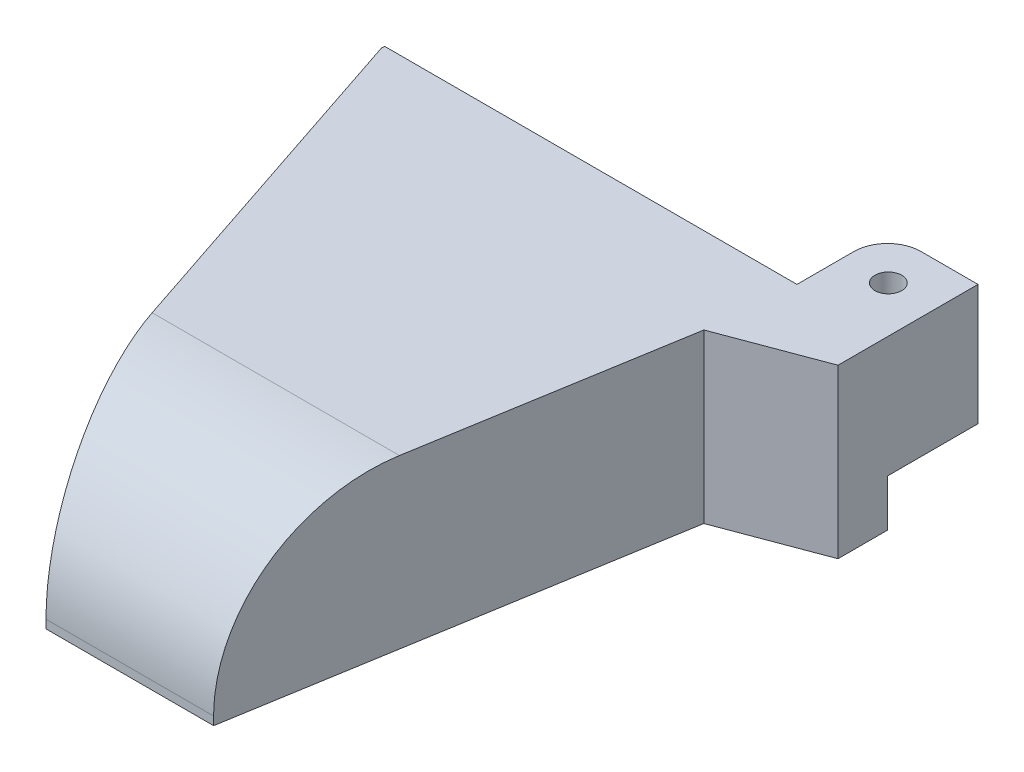
ISO-10303-21;
HEADER;
FILE_DESCRIPTION(('STEP AP214'),'2;1');
FILE_NAME('part.step','',(''),(''),'','','');
FILE_SCHEMA(('AUTOMOTIVE_DESIGN { 1 0 10303 214 1 1 1 1 }'));
ENDSEC;
DATA;
#1=APPLICATION_CONTEXT('core data for automotive mechanical design processes');
#2=APPLICATION_PROTOCOL_DEFINITION('international standard','automotive_design',2000,#1);
#3=PRODUCT_CONTEXT('',#1,'mechanical');
#4=PRODUCT('Part','Part','',(#3));
#5=PRODUCT_RELATED_PRODUCT_CATEGORY('part','',(#4));
#6=PRODUCT_DEFINITION_FORMATION('','',#4);
#7=PRODUCT_DEFINITION_CONTEXT('part definition',#1,'design');
#8=PRODUCT_DEFINITION('design','',#6,#7);
#9=PRODUCT_DEFINITION_SHAPE('','',#8);
#10=(LENGTH_UNIT() NAMED_UNIT(*) SI_UNIT(.MILLI.,.METRE.));
#11=(NAMED_UNIT(*) PLANE_ANGLE_UNIT() SI_UNIT($,.RADIAN.));
#12=(NAMED_UNIT(*) SI_UNIT($,.STERADIAN.) SOLID_ANGLE_UNIT());
#13=UNCERTAINTY_MEASURE_WITH_UNIT(LENGTH_MEASURE(1.E-05),#10,'distance_accuracy_value','');
#14=(GEOMETRIC_REPRESENTATION_CONTEXT(3) GLOBAL_UNCERTAINTY_ASSIGNED_CONTEXT((#13)) GLOBAL_UNIT_ASSIGNED_CONTEXT((#10,
#11,#12)) REPRESENTATION_CONTEXT('',''));
#15=CARTESIAN_POINT('',(0.,0.,0.));
#16=DIRECTION('',(0.,0.,1.));
#17=DIRECTION('',(1.,0.,0.));
#18=AXIS2_PLACEMENT_3D('',#15,#16,#17);
#19=CARTESIAN_POINT('',(2.21988141875647,51.0512483795333,7.6));
#20=DIRECTION('',(-0.932464746481639,0.,0.361260981243385));
#21=DIRECTION('',(0.361260981243385,0.,0.932464746481639));
#22=AXIS2_PLACEMENT_3D('',#19,#20,#21);
#23=PLANE('',#22);
#24=DIRECTION('',(0.361260981243385,0.,0.932464746481639));
#25=VECTOR('',#24,1.);
#26=CARTESIAN_POINT('',(1.60000000000001,10.4,6.));
#27=LINE('',#26,#25);
#28=CARTESIAN_POINT('',(1.60000000000001,10.4,6.));
#29=VERTEX_POINT('',#28);
#30=CARTESIAN_POINT('',(2.21988141875647,10.4,7.6));
#31=VERTEX_POINT('',#30);
#32=EDGE_CURVE('E205',#29,#31,#27,.T.);
#33=ORIENTED_EDGE('',*,*,#32,.T.);
#34=DIRECTION('',(0.,-1.,0.));
#35=VECTOR('',#34,1.);
#36=CARTESIAN_POINT('',(2.21988141875647,51.0512483795333,7.6));
#37=LINE('',#36,#35);
#38=CARTESIAN_POINT('',(2.21988141875647,3.6,7.6));
#39=VERTEX_POINT('',#38);
#40=EDGE_CURVE('E234',#31,#39,#37,.T.);
#41=ORIENTED_EDGE('',*,*,#40,.T.);
#42=DIRECTION('',(-0.361260981243385,0.,-0.932464746481639));
#43=VECTOR('',#42,1.);
#44=CARTESIAN_POINT('',(2.21988141875647,3.6,7.6));
#45=LINE('',#44,#43);
#46=CARTESIAN_POINT('',(1.60000000000001,3.6,6.));
#47=VERTEX_POINT('',#46);
#48=EDGE_CURVE('E244',#39,#47,#45,.T.);
#49=ORIENTED_EDGE('',*,*,#48,.T.);
#50=DIRECTION('',(0.,-1.,0.));
#51=VECTOR('',#50,1.);
#52=CARTESIAN_POINT('',(1.6,12.,6.));
#53=LINE('',#52,#51);
#54=EDGE_CURVE('E336',#29,#47,#53,.T.);
#55=ORIENTED_EDGE('',*,*,#54,.F.);
#56=EDGE_LOOP('',(#33,#41,#49,#55));
#57=FACE_BOUND('',#56,.T.);
#58=ADVANCED_FACE('F39',(#57),#23,.F.);
#59=CARTESIAN_POINT('',(23.1112633252538,51.0512483795333,7.6));
#60=DIRECTION('',(0.984104227150881,0.,0.177591863844508));
#61=DIRECTION('',(0.177591863844508,0.,-0.984104227150882));
#62=AXIS2_PLACEMENT_3D('',#59,#60,#61);
#63=PLANE('',#62);
#64=DIRECTION('',(0.177591863844508,0.,-0.984104227150882));
#65=VECTOR('',#64,1.);
#66=CARTESIAN_POINT('',(23.1112633252538,10.4,7.6));
#67=LINE('',#66,#65);
#68=CARTESIAN_POINT('',(23.1112633252538,10.4,7.6));
#69=VERTEX_POINT('',#68);
#70=CARTESIAN_POINT('',(23.4,10.4,6.));
#71=VERTEX_POINT('',#70);
#72=EDGE_CURVE('E232',#69,#71,#67,.T.);
#73=ORIENTED_EDGE('',*,*,#72,.T.);
#74=DIRECTION('',(0.,-1.,0.));
#75=VECTOR('',#74,1.);
#76=CARTESIAN_POINT('',(23.4,12.,6.));
#77=LINE('',#76,#75);
#78=CARTESIAN_POINT('',(23.4,3.6,6.));
#79=VERTEX_POINT('',#78);
#80=EDGE_CURVE('E320',#71,#79,#77,.T.);
#81=ORIENTED_EDGE('',*,*,#80,.T.);
#82=DIRECTION('',(-0.177591863844508,0.,0.984104227150882));
#83=VECTOR('',#82,1.);
#84=CARTESIAN_POINT('',(23.1112633252538,3.6,7.6));
#85=LINE('',#84,#83);
#86=CARTESIAN_POINT('',(23.1112633252538,3.6,7.6));
#87=VERTEX_POINT('',#86);
#88=EDGE_CURVE('E241',#79,#87,#85,.T.);
#89=ORIENTED_EDGE('',*,*,#88,.T.);
#90=DIRECTION('',(0.,-1.,0.));
#91=VECTOR('',#90,1.);
#92=CARTESIAN_POINT('',(23.1112633252538,51.0512483795333,7.6));
#93=LINE('',#92,#91);
#94=EDGE_CURVE('E240',#69,#87,#93,.T.);
#95=ORIENTED_EDGE('',*,*,#94,.F.);
#96=EDGE_LOOP('',(#73,#81,#89,#95));
#97=FACE_BOUND('',#96,.T.);
#98=ADVANCED_FACE('F443',(#97),#63,.F.);
#99=CARTESIAN_POINT('',(18.6445966585871,51.0512483795333,34.4));
#100=DIRECTION('',(0.986393923832144,0.,0.164398987305357));
#101=DIRECTION('',(0.164398987305357,0.,-0.986393923832144));
#102=AXIS2_PLACEMENT_3D('',#99,#100,#101);
#103=PLANE('',#102);
#104=DIRECTION('',(-0.164398987305378,0.,0.98639392383214));
#105=VECTOR('',#104,1.);
#106=CARTESIAN_POINT('',(18.6445966585871,2.,34.4));
#107=LINE('',#106,#105);
#108=CARTESIAN_POINT('',(19.3112633252539,2.,30.4));
#109=VERTEX_POINT('',#108);
#110=CARTESIAN_POINT('',(18.6445966585871,2.,34.4));
#111=VERTEX_POINT('',#110);
#112=EDGE_CURVE('E199',#109,#111,#107,.T.);
#113=ORIENTED_EDGE('',*,*,#112,.T.);
#114=CARTESIAN_POINT('',(20.1412596132967,1.4,25.4200222717425));
#115=DIRECTION('',(0.986393923832144,0.,0.164398987305357));
#116=DIRECTION('',(-0.164398987305357,0.,0.986393923832144));
#117=AXIS2_PLACEMENT_3D('',#114,#115,#116);
#118=ELLIPSE('',#117,9.12414379544733,9.);
#119=CARTESIAN_POINT('',(20.1412596132967,10.4,25.4200222717425));
#120=VERTEX_POINT('',#119);
#121=EDGE_CURVE('E350',#111,#120,#118,.F.);
#122=ORIENTED_EDGE('',*,*,#121,.T.);
#123=DIRECTION('',(0.164398987305357,0.,-0.986393923832144));
#124=VECTOR('',#123,1.);
#125=CARTESIAN_POINT('',(18.6445966585871,10.4,34.4));
#126=LINE('',#125,#124);
#127=EDGE_CURVE('E230',#120,#69,#126,.T.);
#128=ORIENTED_EDGE('',*,*,#127,.T.);
#129=ORIENTED_EDGE('',*,*,#94,.T.);
#130=DIRECTION('',(-0.164398987305357,0.,0.986393923832144));
#131=VECTOR('',#130,1.);
#132=CARTESIAN_POINT('',(18.6445966585871,3.6,34.4));
#133=LINE('',#132,#131);
#134=CARTESIAN_POINT('',(19.4779299919205,3.6,29.4));
#135=VERTEX_POINT('',#134);
#136=EDGE_CURVE('E238',#87,#135,#133,.T.);
#137=ORIENTED_EDGE('',*,*,#136,.T.);
#138=CARTESIAN_POINT('',(19.4779299919205,2.6,29.4));
#139=DIRECTION('',(0.986393923832144,0.,0.164398987305357));
#140=DIRECTION('',(-0.164398987305357,0.,0.986393923832144));
#141=AXIS2_PLACEMENT_3D('',#138,#139,#140);
#142=ELLIPSE('',#141,1.0137937550497,1.);
#143=CARTESIAN_POINT('',(19.3112633252539,2.6,30.4));
#144=VERTEX_POINT('',#143);
#145=EDGE_CURVE('E202',#135,#144,#142,.T.);
#146=ORIENTED_EDGE('',*,*,#145,.T.);
#147=DIRECTION('',(0.,-1.,0.));
#148=VECTOR('',#147,1.);
#149=CARTESIAN_POINT('',(19.3112633252539,3.6,30.4));
#150=LINE('',#149,#148);
#151=EDGE_CURVE('E195',#144,#109,#150,.T.);
#152=ORIENTED_EDGE('',*,*,#151,.T.);
#153=EDGE_LOOP('',(#113,#122,#128,#129,#137,#146,#152));
#154=FACE_BOUND('',#153,.T.);
#155=ADVANCED_FACE('F197',(#154),#103,.F.);
#156=CARTESIAN_POINT('',(2.21988141875647,51.0512483795333,7.6));
#157=DIRECTION('',(-0.948683298050514,0.,0.316227766016838));
#158=DIRECTION('',(0.316227766016838,0.,0.948683298050514));
#159=AXIS2_PLACEMENT_3D('',#156,#157,#158);
#160=PLANE('',#159);
#161=DIRECTION('',(0.316227766016838,0.,0.948683298050514));
#162=VECTOR('',#161,1.);
#163=CARTESIAN_POINT('',(2.21988141875647,10.4,7.6));
#164=LINE('',#163,#162);
#165=CARTESIAN_POINT('',(8.15988884267065,10.4,25.4200222717425));
#166=VERTEX_POINT('',#165);
#167=EDGE_CURVE('E227',#31,#166,#164,.T.);
#168=ORIENTED_EDGE('',*,*,#167,.T.);
#169=CARTESIAN_POINT('',(8.15988884267065,1.4,25.4200222717425));
#170=DIRECTION('',(-0.948683298050514,0.,0.316227766016838));
#171=DIRECTION('',(-0.316227766016838,0.,-0.948683298050514));
#172=AXIS2_PLACEMENT_3D('',#169,#170,#171);
#173=ELLIPSE('',#172,9.48683298050514,9.);
#174=CARTESIAN_POINT('',(11.1532147520898,2.,34.4));
#175=VERTEX_POINT('',#174);
#176=EDGE_CURVE('E354',#166,#175,#173,.F.);
#177=ORIENTED_EDGE('',*,*,#176,.T.);
#178=DIRECTION('',(-0.316227766016845,0.,-0.948683298050512));
#179=VECTOR('',#178,1.);
#180=CARTESIAN_POINT('',(9.81988141875643,2.,30.4));
#181=LINE('',#180,#179);
#182=CARTESIAN_POINT('',(9.81988141875643,2.,30.4));
#183=VERTEX_POINT('',#182);
#184=EDGE_CURVE('E215',#175,#183,#181,.T.);
#185=ORIENTED_EDGE('',*,*,#184,.T.);
#186=DIRECTION('',(0.,-1.,0.));
#187=VECTOR('',#186,1.);
#188=CARTESIAN_POINT('',(9.81988141875643,3.6,30.4));
#189=LINE('',#188,#187);
#190=CARTESIAN_POINT('',(9.81988141875643,2.6,30.4));
#191=VERTEX_POINT('',#190);
#192=EDGE_CURVE('E206',#191,#183,#189,.T.);
#193=ORIENTED_EDGE('',*,*,#192,.F.);
#194=CARTESIAN_POINT('',(9.48654808542313,2.6,29.4));
#195=DIRECTION('',(-0.948683298050514,0.,0.316227766016838));
#196=DIRECTION('',(-0.316227766016838,0.,-0.948683298050514));
#197=AXIS2_PLACEMENT_3D('',#194,#195,#196);
#198=ELLIPSE('',#197,1.05409255338946,1.);
#199=CARTESIAN_POINT('',(9.48654808542313,3.6,29.4));
#200=VERTEX_POINT('',#199);
#201=EDGE_CURVE('E371',#191,#200,#198,.T.);
#202=ORIENTED_EDGE('',*,*,#201,.T.);
#203=DIRECTION('',(-0.316227766016838,0.,-0.948683298050514));
#204=VECTOR('',#203,1.);
#205=CARTESIAN_POINT('',(2.21988141875647,3.6,7.6));
#206=LINE('',#205,#204);
#207=EDGE_CURVE('E235',#200,#39,#206,.T.);
#208=ORIENTED_EDGE('',*,*,#207,.T.);
#209=ORIENTED_EDGE('',*,*,#40,.F.);
#210=EDGE_LOOP('',(#168,#177,#185,#193,#202,#208,#209));
#211=FACE_BOUND('',#210,.T.);
#212=ADVANCED_FACE('F462',(#211),#160,.F.);
#213=CARTESIAN_POINT('',(1.6,3.6,-16.0586367369971));
#214=DIRECTION('',(0.,1.,0.));
#215=DIRECTION('',(0.,0.,1.));
#216=AXIS2_PLACEMENT_3D('',#213,#214,#215);
#217=PLANE('',#216);
#218=ORIENTED_EDGE('',*,*,#207,.F.);
#219=DIRECTION('',(1.,0.,0.));
#220=VECTOR('',#219,1.);
#221=CARTESIAN_POINT('',(19.3112633252538,3.6,29.4));
#222=LINE('',#221,#220);
#223=EDGE_CURVE('E365',#200,#135,#222,.T.);
#224=ORIENTED_EDGE('',*,*,#223,.T.);
#225=ORIENTED_EDGE('',*,*,#136,.F.);
#226=ORIENTED_EDGE('',*,*,#88,.F.);
#227=DIRECTION('',(0.,0.,1.));
#228=VECTOR('',#227,1.);
#229=CARTESIAN_POINT('',(23.4,3.6,-16.0586367369971));
#230=LINE('',#229,#228);
#231=CARTESIAN_POINT('',(23.4,3.6,5.8));
#232=VERTEX_POINT('',#231);
#233=EDGE_CURVE('E265',#232,#79,#230,.T.);
#234=ORIENTED_EDGE('',*,*,#233,.F.);
#235=DIRECTION('',(1.,0.,0.));
#236=VECTOR('',#235,1.);
#237=CARTESIAN_POINT('',(1.6,3.6,5.8));
#238=LINE('',#237,#236);
#239=CARTESIAN_POINT('',(1.6,3.6,5.8));
#240=VERTEX_POINT('',#239);
#241=EDGE_CURVE('E268',#240,#232,#238,.T.);
#242=ORIENTED_EDGE('',*,*,#241,.F.);
#243=DIRECTION('',(0.,0.,1.));
#244=VECTOR('',#243,1.);
#245=CARTESIAN_POINT('',(1.6,3.6,-16.0586367369971));
#246=LINE('',#245,#244);
#247=EDGE_CURVE('E272',#240,#47,#246,.T.);
#248=ORIENTED_EDGE('',*,*,#247,.T.);
#249=ORIENTED_EDGE('',*,*,#48,.F.);
#250=EDGE_LOOP('',(#218,#224,#225,#226,#234,#242,#248,#249));
#251=FACE_BOUND('',#250,.T.);
#252=ADVANCED_FACE('F459',(#251),#217,.T.);
#253=CARTESIAN_POINT('',(0.,12.,5.8));
#254=DIRECTION('',(0.,0.,1.));
#255=DIRECTION('',(1.,0.,0.));
#256=AXIS2_PLACEMENT_3D('',#253,#254,#255);
#257=PLANE('',#256);
#258=DIRECTION('',(0.,-1.,0.));
#259=VECTOR('',#258,1.);
#260=CARTESIAN_POINT('',(0.,12.,5.8));
#261=LINE('',#260,#259);
#262=CARTESIAN_POINT('',(0.,12.,5.8));
#263=VERTEX_POINT('',#262);
#264=CARTESIAN_POINT('',(0.,2.,5.8));
#265=VERTEX_POINT('',#264);
#266=EDGE_CURVE('E328',#263,#265,#261,.T.);
#267=ORIENTED_EDGE('',*,*,#266,.F.);
#268=DIRECTION('',(-1.,0.,0.));
#269=VECTOR('',#268,1.);
#270=CARTESIAN_POINT('',(0.,12.,5.8));
#271=LINE('',#270,#269);
#272=CARTESIAN_POINT('',(24.6,12.,5.8));
#273=VERTEX_POINT('',#272);
#274=EDGE_CURVE('E326',#273,#263,#271,.T.);
#275=ORIENTED_EDGE('',*,*,#274,.F.);
#276=DIRECTION('',(0.,1.,0.));
#277=VECTOR('',#276,1.);
#278=CARTESIAN_POINT('',(24.6,12.,5.8));
#279=LINE('',#278,#277);
#280=CARTESIAN_POINT('',(24.6,4.8,5.8));
#281=VERTEX_POINT('',#280);
#282=EDGE_CURVE('E290',#281,#273,#279,.T.);
#283=ORIENTED_EDGE('',*,*,#282,.F.);
#284=DIRECTION('',(-1.,0.,0.));
#285=VECTOR('',#284,1.);
#286=CARTESIAN_POINT('',(30.,4.8,5.8));
#287=LINE('',#286,#285);
#288=CARTESIAN_POINT('',(30.,4.8,5.8));
#289=VERTEX_POINT('',#288);
#290=EDGE_CURVE('E283',#289,#281,#287,.T.);
#291=ORIENTED_EDGE('',*,*,#290,.F.);
#292=DIRECTION('',(0.,-1.,0.));
#293=VECTOR('',#292,1.);
#294=CARTESIAN_POINT('',(30.,12.,5.8));
#295=LINE('',#294,#293);
#296=CARTESIAN_POINT('',(30.,2.,5.8));
#297=VERTEX_POINT('',#296);
#298=EDGE_CURVE('E306',#289,#297,#295,.T.);
#299=ORIENTED_EDGE('',*,*,#298,.T.);
#300=DIRECTION('',(-1.,0.,0.));
#301=VECTOR('',#300,1.);
#302=CARTESIAN_POINT('',(0.,2.,5.8));
#303=LINE('',#302,#301);
#304=EDGE_CURVE('E322',#297,#265,#303,.T.);
#305=ORIENTED_EDGE('',*,*,#304,.T.);
#306=EDGE_LOOP('',(#267,#275,#283,#291,#299,#305));
#307=FACE_BOUND('',#306,.T.);
#308=DIRECTION('',(0.,-1.,0.));
#309=VECTOR('',#308,1.);
#310=CARTESIAN_POINT('',(23.4,12.,5.8));
#311=LINE('',#310,#309);
#312=CARTESIAN_POINT('',(23.4,10.4,5.8));
#313=VERTEX_POINT('',#312);
#314=EDGE_CURVE('E318',#313,#232,#311,.T.);
#315=ORIENTED_EDGE('',*,*,#314,.F.);
#316=DIRECTION('',(-1.,0.,0.));
#317=VECTOR('',#316,1.);
#318=CARTESIAN_POINT('',(1.6,10.4,5.8));
#319=LINE('',#318,#317);
#320=CARTESIAN_POINT('',(1.6,10.4,5.8));
#321=VERTEX_POINT('',#320);
#322=EDGE_CURVE('E315',#313,#321,#319,.T.);
#323=ORIENTED_EDGE('',*,*,#322,.T.);
#324=DIRECTION('',(0.,-1.,0.));
#325=VECTOR('',#324,1.);
#326=CARTESIAN_POINT('',(1.6,12.,5.8));
#327=LINE('',#326,#325);
#328=EDGE_CURVE('E333',#321,#240,#327,.T.);
#329=ORIENTED_EDGE('',*,*,#328,.T.);
#330=ORIENTED_EDGE('',*,*,#241,.T.);
#331=EDGE_LOOP('',(#315,#323,#329,#330));
#332=FACE_BOUND('',#331,.T.);
#333=ADVANCED_FACE('F410',(#307,#332),#257,.F.);
#334=CARTESIAN_POINT('',(1.6,12.,5.8));
#335=DIRECTION('',(-1.,0.,0.));
#336=DIRECTION('',(0.,0.,1.));
#337=AXIS2_PLACEMENT_3D('',#334,#335,#336);
#338=PLANE('',#337);
#339=ORIENTED_EDGE('',*,*,#54,.T.);
#340=ORIENTED_EDGE('',*,*,#247,.F.);
#341=ORIENTED_EDGE('',*,*,#328,.F.);
#342=DIRECTION('',(0.,0.,1.));
#343=VECTOR('',#342,1.);
#344=CARTESIAN_POINT('',(1.6,10.4,5.8));
#345=LINE('',#344,#343);
#346=EDGE_CURVE('E309',#321,#29,#345,.T.);
#347=ORIENTED_EDGE('',*,*,#346,.T.);
#348=EDGE_LOOP('',(#339,#340,#341,#347));
#349=FACE_BOUND('',#348,.T.);
#350=ADVANCED_FACE('F478',(#349),#338,.F.);
#351=CARTESIAN_POINT('',(23.4,12.,6.));
#352=DIRECTION('',(1.,0.,0.));
#353=DIRECTION('',(0.,0.,-1.));
#354=AXIS2_PLACEMENT_3D('',#351,#352,#353);
#355=PLANE('',#354);
#356=ORIENTED_EDGE('',*,*,#314,.T.);
#357=ORIENTED_EDGE('',*,*,#233,.T.);
#358=ORIENTED_EDGE('',*,*,#80,.F.);
#359=DIRECTION('',(0.,0.,-1.));
#360=VECTOR('',#359,1.);
#361=CARTESIAN_POINT('',(23.4,10.4,5.8));
#362=LINE('',#361,#360);
#363=EDGE_CURVE('E312',#71,#313,#362,.T.);
#364=ORIENTED_EDGE('',*,*,#363,.T.);
#365=EDGE_LOOP('',(#356,#357,#358,#364));
#366=FACE_BOUND('',#365,.T.);
#367=ADVANCED_FACE('F475',(#366),#355,.F.);
#368=CARTESIAN_POINT('',(0.,2.,0.));
#369=DIRECTION('',(1.,0.,0.));
#370=DIRECTION('',(0.,0.,-1.));
#371=AXIS2_PLACEMENT_3D('',#368,#369,#370);
#372=PLANE('',#371);
#373=ORIENTED_EDGE('',*,*,#266,.T.);
#374=DIRECTION('',(0.,0.,-1.));
#375=VECTOR('',#374,1.);
#376=CARTESIAN_POINT('',(0.,2.,0.));
#377=LINE('',#376,#375);
#378=CARTESIAN_POINT('',(0.,2.,6.));
#379=VERTEX_POINT('',#378);
#380=EDGE_CURVE('E271',#379,#265,#377,.T.);
#381=ORIENTED_EDGE('',*,*,#380,.F.);
#382=DIRECTION('',(0.,-1.,0.));
#383=VECTOR('',#382,1.);
#384=CARTESIAN_POINT('',(0.,2.,6.));
#385=LINE('',#384,#383);
#386=CARTESIAN_POINT('',(0.,12.,6.));
#387=VERTEX_POINT('',#386);
#388=EDGE_CURVE('E339',#387,#379,#385,.T.);
#389=ORIENTED_EDGE('',*,*,#388,.F.);
#390=DIRECTION('',(0.,0.,1.));
#391=VECTOR('',#390,1.);
#392=CARTESIAN_POINT('',(0.,12.,5.8));
#393=LINE('',#392,#391);
#394=EDGE_CURVE('E323',#263,#387,#393,.T.);
#395=ORIENTED_EDGE('',*,*,#394,.F.);
#396=EDGE_LOOP('',(#373,#381,#389,#395));
#397=FACE_BOUND('',#396,.T.);
#398=ADVANCED_FACE('F407',(#397),#372,.F.);
#399=CARTESIAN_POINT('',(30.,2.,0.));
#400=DIRECTION('',(-1.,0.,0.));
#401=DIRECTION('',(0.,0.,1.));
#402=AXIS2_PLACEMENT_3D('',#399,#400,#401);
#403=PLANE('',#402);
#404=DIRECTION('',(0.,0.,-1.));
#405=VECTOR('',#404,1.);
#406=CARTESIAN_POINT('',(30.,12.,5.8));
#407=LINE('',#406,#405);
#408=CARTESIAN_POINT('',(30.,12.,8.75085008936771));
#409=VERTEX_POINT('',#408);
#410=CARTESIAN_POINT('',(30.,12.,0.399999999999999));
#411=VERTEX_POINT('',#410);
#412=EDGE_CURVE('E55',#409,#411,#407,.T.);
#413=ORIENTED_EDGE('',*,*,#412,.F.);
#414=DIRECTION('',(0.,-1.,0.));
#415=VECTOR('',#414,1.);
#416=CARTESIAN_POINT('',(30.,2.,8.75085008936771));
#417=LINE('',#416,#415);
#418=CARTESIAN_POINT('',(30.,2.,8.75085008936771));
#419=VERTEX_POINT('',#418);
#420=EDGE_CURVE('E376',#409,#419,#417,.T.);
#421=ORIENTED_EDGE('',*,*,#420,.T.);
#422=DIRECTION('',(0.,0.,-1.));
#423=VECTOR('',#422,1.);
#424=CARTESIAN_POINT('',(30.,2.,0.));
#425=LINE('',#424,#423);
#426=EDGE_CURVE('E62',#419,#297,#425,.T.);
#427=ORIENTED_EDGE('',*,*,#426,.T.);
#428=ORIENTED_EDGE('',*,*,#298,.F.);
#429=DIRECTION('',(0.,0.,1.));
#430=VECTOR('',#429,1.);
#431=CARTESIAN_POINT('',(30.,4.8,0.399999999999999));
#432=LINE('',#431,#430);
#433=CARTESIAN_POINT('',(30.,4.8,0.399999999999999));
#434=VERTEX_POINT('',#433);
#435=EDGE_CURVE('E303',#434,#289,#432,.T.);
#436=ORIENTED_EDGE('',*,*,#435,.F.);
#437=DIRECTION('',(0.,-1.,0.));
#438=VECTOR('',#437,1.);
#439=CARTESIAN_POINT('',(30.,12.,0.399999999999999));
#440=LINE('',#439,#438);
#441=EDGE_CURVE('E286',#411,#434,#440,.T.);
#442=ORIENTED_EDGE('',*,*,#441,.F.);
#443=EDGE_LOOP('',(#413,#421,#427,#428,#436,#442));
#444=FACE_BOUND('',#443,.T.);
#445=ADVANCED_FACE('F416',(#444),#403,.F.);
#446=CARTESIAN_POINT('',(0.,12.,0.));
#447=DIRECTION('',(0.,1.,0.));
#448=DIRECTION('',(0.,0.,1.));
#449=AXIS2_PLACEMENT_3D('',#446,#447,#448);
#450=PLANE('',#449);
#451=DIRECTION('',(0.316227766016838,0.,0.948683298050514));
#452=VECTOR('',#451,1.);
#453=CARTESIAN_POINT('',(0.,12.,6.));
#454=LINE('',#453,#452);
#455=CARTESIAN_POINT('',(6.83333333333333,12.,26.5));
#456=VERTEX_POINT('',#455);
#457=EDGE_CURVE('E237',#387,#456,#454,.T.);
#458=ORIENTED_EDGE('',*,*,#457,.T.);
#459=DIRECTION('',(1.,0.,0.));
#460=VECTOR('',#459,1.);
#461=CARTESIAN_POINT('',(0.,12.,26.5));
#462=LINE('',#461,#460);
#463=CARTESIAN_POINT('',(21.5833333333333,12.,26.5));
#464=VERTEX_POINT('',#463);
#465=EDGE_CURVE('E356',#456,#464,#462,.T.);
#466=ORIENTED_EDGE('',*,*,#465,.T.);
#467=DIRECTION('',(0.164398987305357,0.,-0.986393923832144));
#468=VECTOR('',#467,1.);
#469=CARTESIAN_POINT('',(20.,12.,36.));
#470=LINE('',#469,#468);
#471=CARTESIAN_POINT('',(24.1780050634732,12.,10.9319696191608));
#472=VERTEX_POINT('',#471);
#473=EDGE_CURVE('E246',#464,#472,#470,.T.);
#474=ORIENTED_EDGE('',*,*,#473,.T.);
#475=DIRECTION('',(0.936441689829929,0.,-0.350823262553194));
#476=VECTOR('',#475,1.);
#477=CARTESIAN_POINT('',(37.3427591072748,12.,6.));
#478=LINE('',#477,#476);
#479=EDGE_CURVE('E11',#472,#409,#478,.T.);
#480=ORIENTED_EDGE('',*,*,#479,.T.);
#481=ORIENTED_EDGE('',*,*,#412,.T.);
#482=DIRECTION('',(1.,0.,0.));
#483=VECTOR('',#482,1.);
#484=CARTESIAN_POINT('',(30.,12.,0.399999999999999));
#485=LINE('',#484,#483);
#486=CARTESIAN_POINT('',(26.6,12.,0.399999999999999));
#487=VERTEX_POINT('',#486);
#488=EDGE_CURVE('E293',#487,#411,#485,.T.);
#489=ORIENTED_EDGE('',*,*,#488,.F.);
#490=CARTESIAN_POINT('',(26.6,12.,2.4));
#491=DIRECTION('',(0.,1.,0.));
#492=DIRECTION('',(0.,0.,1.));
#493=AXIS2_PLACEMENT_3D('',#490,#491,#492);
#494=CIRCLE('',#493,2.);
#495=CARTESIAN_POINT('',(24.6,12.,2.4));
#496=VERTEX_POINT('',#495);
#497=EDGE_CURVE('E344',#487,#496,#494,.T.);
#498=ORIENTED_EDGE('',*,*,#497,.T.);
#499=DIRECTION('',(0.,0.,1.));
#500=VECTOR('',#499,1.);
#501=CARTESIAN_POINT('',(24.6,12.,0.399999999999999));
#502=LINE('',#501,#500);
#503=EDGE_CURVE('E295',#496,#273,#502,.T.);
#504=ORIENTED_EDGE('',*,*,#503,.T.);
#505=ORIENTED_EDGE('',*,*,#274,.T.);
#506=ORIENTED_EDGE('',*,*,#394,.T.);
#507=EDGE_LOOP('',(#458,#466,#474,#480,#481,#489,#498,#504,#505,#506));
#508=FACE_BOUND('',#507,.T.);
#509=CARTESIAN_POINT('',(27.25,12.,3.));
#510=DIRECTION('',(0.,-1.,0.));
#511=DIRECTION('',(0.,0.,-1.));
#512=AXIS2_PLACEMENT_3D('',#509,#510,#511);
#513=CIRCLE('',#512,0.799999999999999);
#514=CARTESIAN_POINT('',(27.25,12.,2.2));
#515=VERTEX_POINT('',#514);
#516=EDGE_CURVE('E280',#515,#515,#513,.T.);
#517=ORIENTED_EDGE('',*,*,#516,.T.);
#518=EDGE_LOOP('',(#517));
#519=FACE_BOUND('',#518,.T.);
#520=ADVANCED_FACE('F388',(#508,#519),#450,.T.);
#521=CARTESIAN_POINT('',(0.,10.4,0.));
#522=DIRECTION('',(0.,1.,0.));
#523=DIRECTION('',(0.,0.,1.));
#524=AXIS2_PLACEMENT_3D('',#521,#522,#523);
#525=PLANE('',#524);
#526=ORIENTED_EDGE('',*,*,#127,.F.);
#527=DIRECTION('',(-1.,0.,0.));
#528=VECTOR('',#527,1.);
#529=CARTESIAN_POINT('',(0.,10.4,25.4200222717425));
#530=LINE('',#529,#528);
#531=EDGE_CURVE('E352',#120,#166,#530,.T.);
#532=ORIENTED_EDGE('',*,*,#531,.T.);
#533=ORIENTED_EDGE('',*,*,#167,.F.);
#534=ORIENTED_EDGE('',*,*,#32,.F.);
#535=ORIENTED_EDGE('',*,*,#346,.F.);
#536=ORIENTED_EDGE('',*,*,#322,.F.);
#537=ORIENTED_EDGE('',*,*,#363,.F.);
#538=ORIENTED_EDGE('',*,*,#72,.F.);
#539=EDGE_LOOP('',(#526,#532,#533,#534,#535,#536,#537,#538));
#540=FACE_BOUND('',#539,.T.);
#541=ADVANCED_FACE('F470',(#540),#525,.F.);
#542=CARTESIAN_POINT('',(30.,4.8,0.399999999999999));
#543=DIRECTION('',(0.,1.,0.));
#544=DIRECTION('',(0.,0.,1.));
#545=AXIS2_PLACEMENT_3D('',#542,#543,#544);
#546=PLANE('',#545);
#547=CARTESIAN_POINT('',(27.25,4.8,3.));
#548=DIRECTION('',(0.,-1.,0.));
#549=DIRECTION('',(0.,0.,-1.));
#550=AXIS2_PLACEMENT_3D('',#547,#548,#549);
#551=CIRCLE('',#550,0.799999999999999);
#552=CARTESIAN_POINT('',(27.25,4.8,2.2));
#553=VERTEX_POINT('',#552);
#554=EDGE_CURVE('E278',#553,#553,#551,.T.);
#555=ORIENTED_EDGE('',*,*,#554,.F.);
#556=EDGE_LOOP('',(#555));
#557=FACE_BOUND('',#556,.T.);
#558=DIRECTION('',(0.,0.,1.));
#559=VECTOR('',#558,1.);
#560=CARTESIAN_POINT('',(24.6,4.8,0.399999999999999));
#561=LINE('',#560,#559);
#562=CARTESIAN_POINT('',(24.6,4.8,2.4));
#563=VERTEX_POINT('',#562);
#564=EDGE_CURVE('E301',#563,#281,#561,.T.);
#565=ORIENTED_EDGE('',*,*,#564,.F.);
#566=CARTESIAN_POINT('',(26.6,4.8,2.4));
#567=DIRECTION('',(0.,1.,0.));
#568=DIRECTION('',(0.,0.,1.));
#569=AXIS2_PLACEMENT_3D('',#566,#567,#568);
#570=CIRCLE('',#569,2.);
#571=CARTESIAN_POINT('',(26.6,4.8,0.399999999999999));
#572=VERTEX_POINT('',#571);
#573=EDGE_CURVE('E348',#563,#572,#570,.F.);
#574=ORIENTED_EDGE('',*,*,#573,.T.);
#575=DIRECTION('',(-1.,0.,0.));
#576=VECTOR('',#575,1.);
#577=CARTESIAN_POINT('',(30.,4.8,0.399999999999999));
#578=LINE('',#577,#576);
#579=EDGE_CURVE('E289',#434,#572,#578,.T.);
#580=ORIENTED_EDGE('',*,*,#579,.F.);
#581=ORIENTED_EDGE('',*,*,#435,.T.);
#582=ORIENTED_EDGE('',*,*,#290,.T.);
#583=EDGE_LOOP('',(#565,#574,#580,#581,#582));
#584=FACE_BOUND('',#583,.T.);
#585=ADVANCED_FACE('F419',(#557,#584),#546,.F.);
#586=CARTESIAN_POINT('',(24.6,12.,0.399999999999999));
#587=DIRECTION('',(1.,0.,0.));
#588=DIRECTION('',(0.,0.,-1.));
#589=AXIS2_PLACEMENT_3D('',#586,#587,#588);
#590=PLANE('',#589);
#591=ORIENTED_EDGE('',*,*,#503,.F.);
#592=DIRECTION('',(0.,1.,0.));
#593=VECTOR('',#592,1.);
#594=CARTESIAN_POINT('',(24.6,4.8,2.4));
#595=LINE('',#594,#593);
#596=EDGE_CURVE('E346',#496,#563,#595,.F.);
#597=ORIENTED_EDGE('',*,*,#596,.T.);
#598=ORIENTED_EDGE('',*,*,#564,.T.);
#599=ORIENTED_EDGE('',*,*,#282,.T.);
#600=EDGE_LOOP('',(#591,#597,#598,#599));
#601=FACE_BOUND('',#600,.T.);
#602=ADVANCED_FACE('F428',(#601),#590,.F.);
#603=CARTESIAN_POINT('',(0.,0.,0.399999999999999));
#604=DIRECTION('',(0.,0.,-1.));
#605=DIRECTION('',(-1.,0.,0.));
#606=AXIS2_PLACEMENT_3D('',#603,#604,#605);
#607=PLANE('',#606);
#608=ORIENTED_EDGE('',*,*,#579,.T.);
#609=DIRECTION('',(0.,1.,0.));
#610=VECTOR('',#609,1.);
#611=CARTESIAN_POINT('',(26.6,12.,0.399999999999999));
#612=LINE('',#611,#610);
#613=EDGE_CURVE('E341',#572,#487,#612,.T.);
#614=ORIENTED_EDGE('',*,*,#613,.T.);
#615=ORIENTED_EDGE('',*,*,#488,.T.);
#616=ORIENTED_EDGE('',*,*,#441,.T.);
#617=EDGE_LOOP('',(#608,#614,#615,#616));
#618=FACE_BOUND('',#617,.T.);
#619=ADVANCED_FACE('F423',(#618),#607,.T.);
#620=CARTESIAN_POINT('',(26.6,0.,2.4));
#621=DIRECTION('',(0.,-1.,0.));
#622=DIRECTION('',(0.,0.,-1.));
#623=AXIS2_PLACEMENT_3D('',#620,#621,#622);
#624=CYLINDRICAL_SURFACE('',#623,2.);
#625=ORIENTED_EDGE('',*,*,#573,.F.);
#626=ORIENTED_EDGE('',*,*,#596,.F.);
#627=ORIENTED_EDGE('',*,*,#497,.F.);
#628=ORIENTED_EDGE('',*,*,#613,.F.);
#629=EDGE_LOOP('',(#625,#626,#627,#628));
#630=FACE_BOUND('',#629,.T.);
#631=ADVANCED_FACE('F429',(#630),#624,.T.);
#632=CARTESIAN_POINT('',(27.25,12.,3.));
#633=DIRECTION('',(0.,-1.,0.));
#634=DIRECTION('',(0.,0.,-1.));
#635=AXIS2_PLACEMENT_3D('',#632,#633,#634);
#636=CYLINDRICAL_SURFACE('',#635,0.799999999999999);
#637=ORIENTED_EDGE('',*,*,#516,.F.);
#638=EDGE_LOOP('',(#637));
#639=FACE_BOUND('',#638,.T.);
#640=ORIENTED_EDGE('',*,*,#554,.T.);
#641=EDGE_LOOP('',(#640));
#642=FACE_BOUND('',#641,.T.);
#643=ADVANCED_FACE('F431',(#639,#642),#636,.F.);
#644=CARTESIAN_POINT('',(30.,2.,0.));
#645=DIRECTION('',(0.,1.,0.));
#646=DIRECTION('',(0.,0.,1.));
#647=AXIS2_PLACEMENT_3D('',#644,#645,#646);
#648=PLANE('',#647);
#649=DIRECTION('',(1.,0.,0.));
#650=VECTOR('',#649,1.);
#651=CARTESIAN_POINT('',(19.3112633252539,2.,30.4));
#652=LINE('',#651,#650);
#653=EDGE_CURVE('E209',#183,#109,#652,.T.);
#654=ORIENTED_EDGE('',*,*,#653,.F.);
#655=ORIENTED_EDGE('',*,*,#184,.F.);
#656=DIRECTION('',(-1.,0.,0.));
#657=VECTOR('',#656,1.);
#658=CARTESIAN_POINT('',(11.1532147520898,2.,34.4));
#659=LINE('',#658,#657);
#660=EDGE_CURVE('E219',#111,#175,#659,.T.);
#661=ORIENTED_EDGE('',*,*,#660,.F.);
#662=ORIENTED_EDGE('',*,*,#112,.F.);
#663=EDGE_LOOP('',(#654,#655,#661,#662));
#664=FACE_BOUND('',#663,.T.);
#665=ORIENTED_EDGE('',*,*,#304,.F.);
#666=ORIENTED_EDGE('',*,*,#426,.F.);
#667=DIRECTION('',(-0.936441689829929,0.,0.350823262553194));
#668=VECTOR('',#667,1.);
#669=CARTESIAN_POINT('',(32.8748776532075,2.,7.6738220494022));
#670=LINE('',#669,#668);
#671=CARTESIAN_POINT('',(24.1780050634732,2.,10.9319696191608));
#672=VERTEX_POINT('',#671);
#673=EDGE_CURVE('E48',#419,#672,#670,.T.);
#674=ORIENTED_EDGE('',*,*,#673,.T.);
#675=DIRECTION('',(-0.164398987305357,0.,0.986393923832144));
#676=VECTOR('',#675,1.);
#677=CARTESIAN_POINT('',(20.,2.,36.));
#678=LINE('',#677,#676);
#679=CARTESIAN_POINT('',(20.,2.,36.));
#680=VERTEX_POINT('',#679);
#681=EDGE_CURVE('E249',#672,#680,#678,.T.);
#682=ORIENTED_EDGE('',*,*,#681,.T.);
#683=DIRECTION('',(-1.,0.,0.));
#684=VECTOR('',#683,1.);
#685=CARTESIAN_POINT('',(9.99999999999999,2.,36.));
#686=LINE('',#685,#684);
#687=CARTESIAN_POINT('',(9.99999999999999,2.,36.));
#688=VERTEX_POINT('',#687);
#689=EDGE_CURVE('E256',#680,#688,#686,.T.);
#690=ORIENTED_EDGE('',*,*,#689,.T.);
#691=DIRECTION('',(-0.316227766016838,0.,-0.948683298050514));
#692=VECTOR('',#691,1.);
#693=CARTESIAN_POINT('',(0.,2.,6.));
#694=LINE('',#693,#692);
#695=EDGE_CURVE('E259',#688,#379,#694,.T.);
#696=ORIENTED_EDGE('',*,*,#695,.T.);
#697=ORIENTED_EDGE('',*,*,#380,.T.);
#698=EDGE_LOOP('',(#665,#666,#674,#682,#690,#696,#697));
#699=FACE_BOUND('',#698,.T.);
#700=ADVANCED_FACE('F217',(#664,#699),#648,.F.);
#701=CARTESIAN_POINT('',(0.,3.6,6.));
#702=DIRECTION('',(-0.948683298050514,0.,0.316227766016838));
#703=DIRECTION('',(0.316227766016838,0.,0.948683298050514));
#704=AXIS2_PLACEMENT_3D('',#701,#702,#703);
#705=PLANE('',#704);
#706=DIRECTION('',(0.,-1.,0.));
#707=VECTOR('',#706,1.);
#708=CARTESIAN_POINT('',(9.99999999999999,3.6,36.));
#709=LINE('',#708,#707);
#710=CARTESIAN_POINT('',(9.99999999999999,2.5,36.));
#711=VERTEX_POINT('',#710);
#712=EDGE_CURVE('E263',#711,#688,#709,.T.);
#713=ORIENTED_EDGE('',*,*,#712,.F.);
#714=CARTESIAN_POINT('',(6.83333333333333,2.5,26.5));
#715=DIRECTION('',(-0.948683298050514,0.,0.316227766016838));
#716=DIRECTION('',(0.316227766016838,0.,0.948683298050514));
#717=AXIS2_PLACEMENT_3D('',#714,#715,#716);
#718=ELLIPSE('',#717,10.0138792571999,9.5);
#719=EDGE_CURVE('E363',#711,#456,#718,.T.);
#720=ORIENTED_EDGE('',*,*,#719,.T.);
#721=ORIENTED_EDGE('',*,*,#457,.F.);
#722=ORIENTED_EDGE('',*,*,#388,.T.);
#723=ORIENTED_EDGE('',*,*,#695,.F.);
#724=EDGE_LOOP('',(#713,#720,#721,#722,#723));
#725=FACE_BOUND('',#724,.T.);
#726=ADVANCED_FACE('F400',(#725),#705,.T.);
#727=CARTESIAN_POINT('',(9.99999999999999,3.6,36.));
#728=DIRECTION('',(0.,0.,1.));
#729=DIRECTION('',(1.,0.,0.));
#730=AXIS2_PLACEMENT_3D('',#727,#728,#729);
#731=PLANE('',#730);
#732=DIRECTION('',(0.,-1.,0.));
#733=VECTOR('',#732,1.);
#734=CARTESIAN_POINT('',(20.,3.6,36.));
#735=LINE('',#734,#733);
#736=CARTESIAN_POINT('',(20.,2.5,36.));
#737=VERTEX_POINT('',#736);
#738=EDGE_CURVE('E262',#737,#680,#735,.T.);
#739=ORIENTED_EDGE('',*,*,#738,.F.);
#740=DIRECTION('',(1.,0.,0.));
#741=VECTOR('',#740,1.);
#742=CARTESIAN_POINT('',(9.99999999999999,2.5,36.));
#743=LINE('',#742,#741);
#744=EDGE_CURVE('E361',#737,#711,#743,.F.);
#745=ORIENTED_EDGE('',*,*,#744,.T.);
#746=ORIENTED_EDGE('',*,*,#712,.T.);
#747=ORIENTED_EDGE('',*,*,#689,.F.);
#748=EDGE_LOOP('',(#739,#745,#746,#747));
#749=FACE_BOUND('',#748,.T.);
#750=ADVANCED_FACE('F395',(#749),#731,.T.);
#751=CARTESIAN_POINT('',(20.,3.6,36.));
#752=DIRECTION('',(0.986393923832144,0.,0.164398987305357));
#753=DIRECTION('',(0.164398987305357,0.,-0.986393923832144));
#754=AXIS2_PLACEMENT_3D('',#751,#752,#753);
#755=PLANE('',#754);
#756=ORIENTED_EDGE('',*,*,#681,.F.);
#757=DIRECTION('',(0.,1.,0.));
#758=VECTOR('',#757,1.);
#759=CARTESIAN_POINT('',(24.1780050634732,3.6,10.9319696191608));
#760=LINE('',#759,#758);
#761=EDGE_CURVE('E373',#672,#472,#760,.T.);
#762=ORIENTED_EDGE('',*,*,#761,.T.);
#763=ORIENTED_EDGE('',*,*,#473,.F.);
#764=CARTESIAN_POINT('',(21.5833333333333,2.5,26.5));
#765=DIRECTION('',(0.986393923832144,0.,0.164398987305357));
#766=DIRECTION('',(0.164398987305357,0.,-0.986393923832144));
#767=AXIS2_PLACEMENT_3D('',#764,#765,#766);
#768=ELLIPSE('',#767,9.63104067297218,9.5);
#769=EDGE_CURVE('E359',#464,#737,#768,.T.);
#770=ORIENTED_EDGE('',*,*,#769,.T.);
#771=ORIENTED_EDGE('',*,*,#738,.T.);
#772=EDGE_LOOP('',(#756,#762,#763,#770,#771));
#773=FACE_BOUND('',#772,.T.);
#774=ADVANCED_FACE('F383',(#773),#755,.T.);
#775=CARTESIAN_POINT('',(19.3112633252539,3.6,30.4));
#776=DIRECTION('',(0.,0.,-1.));
#777=DIRECTION('',(-1.,0.,0.));
#778=AXIS2_PLACEMENT_3D('',#775,#776,#777);
#779=PLANE('',#778);
#780=ORIENTED_EDGE('',*,*,#151,.F.);
#781=DIRECTION('',(1.,0.,0.));
#782=VECTOR('',#781,1.);
#783=CARTESIAN_POINT('',(9.81988141875643,2.6,30.4));
#784=LINE('',#783,#782);
#785=EDGE_CURVE('E368',#144,#191,#784,.F.);
#786=ORIENTED_EDGE('',*,*,#785,.T.);
#787=ORIENTED_EDGE('',*,*,#192,.T.);
#788=ORIENTED_EDGE('',*,*,#653,.T.);
#789=EDGE_LOOP('',(#780,#786,#787,#788));
#790=FACE_BOUND('',#789,.T.);
#791=ADVANCED_FACE('F210',(#790),#779,.F.);
#792=CARTESIAN_POINT('',(11.1532147520898,1.4,25.4200222717425));
#793=DIRECTION('',(-1.,0.,0.));
#794=DIRECTION('',(0.,0.,1.));
#795=AXIS2_PLACEMENT_3D('',#792,#793,#794);
#796=CYLINDRICAL_SURFACE('',#795,9.);
#797=ORIENTED_EDGE('',*,*,#176,.F.);
#798=ORIENTED_EDGE('',*,*,#531,.F.);
#799=ORIENTED_EDGE('',*,*,#121,.F.);
#800=ORIENTED_EDGE('',*,*,#660,.T.);
#801=EDGE_LOOP('',(#797,#798,#799,#800));
#802=FACE_BOUND('',#801,.T.);
#803=ADVANCED_FACE('F684',(#802),#796,.F.);
#804=CARTESIAN_POINT('',(0.,2.5,26.5));
#805=DIRECTION('',(1.,0.,0.));
#806=DIRECTION('',(0.,0.,-1.));
#807=AXIS2_PLACEMENT_3D('',#804,#805,#806);
#808=CYLINDRICAL_SURFACE('',#807,9.5);
#809=ORIENTED_EDGE('',*,*,#719,.F.);
#810=ORIENTED_EDGE('',*,*,#744,.F.);
#811=ORIENTED_EDGE('',*,*,#769,.F.);
#812=ORIENTED_EDGE('',*,*,#465,.F.);
#813=EDGE_LOOP('',(#809,#810,#811,#812));
#814=FACE_BOUND('',#813,.T.);
#815=ADVANCED_FACE('F398',(#814),#808,.T.);
#816=CARTESIAN_POINT('',(1.6,2.6,29.4));
#817=DIRECTION('',(-1.,0.,0.));
#818=DIRECTION('',(0.,0.,1.));
#819=AXIS2_PLACEMENT_3D('',#816,#817,#818);
#820=CYLINDRICAL_SURFACE('',#819,1.);
#821=ORIENTED_EDGE('',*,*,#201,.F.);
#822=ORIENTED_EDGE('',*,*,#785,.F.);
#823=ORIENTED_EDGE('',*,*,#145,.F.);
#824=ORIENTED_EDGE('',*,*,#223,.F.);
#825=EDGE_LOOP('',(#821,#822,#823,#824));
#826=FACE_BOUND('',#825,.T.);
#827=ADVANCED_FACE('F691',(#826),#820,.T.);
#828=CARTESIAN_POINT('',(37.3427591072748,2.,6.));
#829=DIRECTION('',(-0.350823262553194,0.,-0.936441689829929));
#830=DIRECTION('',(0.,-1.,0.));
#831=AXIS2_PLACEMENT_3D('',#828,#829,#830);
#832=PLANE('',#831);
#833=ORIENTED_EDGE('',*,*,#479,.F.);
#834=ORIENTED_EDGE('',*,*,#761,.F.);
#835=ORIENTED_EDGE('',*,*,#673,.F.);
#836=ORIENTED_EDGE('',*,*,#420,.F.);
#837=EDGE_LOOP('',(#833,#834,#835,#836));
#838=FACE_BOUND('',#837,.T.);
#839=ADVANCED_FACE('F42',(#838),#832,.F.);
#840=CLOSED_SHELL('',(#58,#98,#155,#212,#252,#333,#350,#367,#398,#445,#520,#541,#585,#602,#619,
#631,#643,#700,#726,#750,#774,#791,#803,#815,#827,#839));
#841=MANIFOLD_SOLID_BREP('B2',#840);
#842=ADVANCED_BREP_SHAPE_REPRESENTATION('',(#18,#841),#14);
#843=SHAPE_DEFINITION_REPRESENTATION(#9,#842);
ENDSEC;
END-ISO-10303-21;
